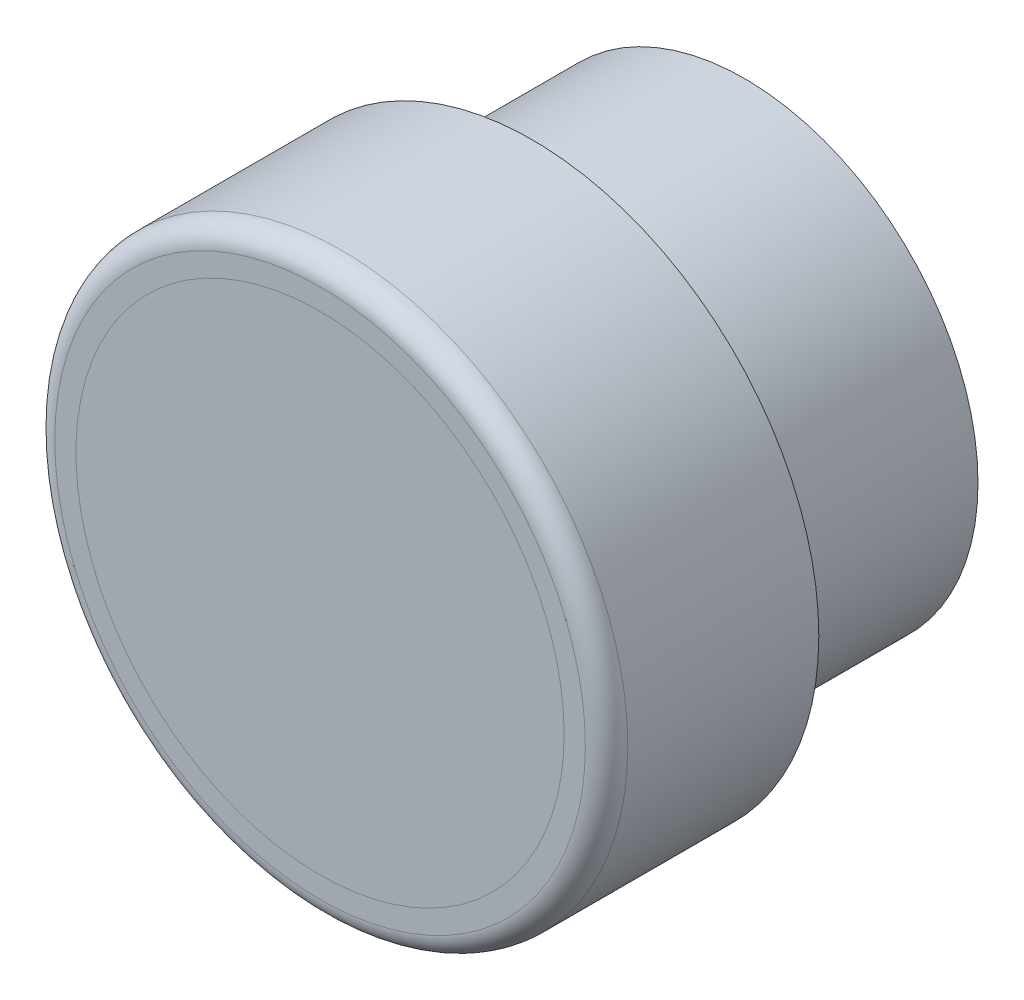
ISO-10303-21;
HEADER;
FILE_DESCRIPTION(('STEP AP214'),'2;1');
FILE_NAME('part.step','',(''),(''),'','','');
FILE_SCHEMA(('AUTOMOTIVE_DESIGN { 1 0 10303 214 1 1 1 1 }'));
ENDSEC;
DATA;
#1=APPLICATION_CONTEXT('core data for automotive mechanical design processes');
#2=APPLICATION_PROTOCOL_DEFINITION('international standard','automotive_design',2000,#1);
#3=PRODUCT_CONTEXT('',#1,'mechanical');
#4=PRODUCT('Part','Part','',(#3));
#5=PRODUCT_RELATED_PRODUCT_CATEGORY('part','',(#4));
#6=PRODUCT_DEFINITION_FORMATION('','',#4);
#7=PRODUCT_DEFINITION_CONTEXT('part definition',#1,'design');
#8=PRODUCT_DEFINITION('design','',#6,#7);
#9=PRODUCT_DEFINITION_SHAPE('','',#8);
#10=(LENGTH_UNIT() NAMED_UNIT(*) SI_UNIT(.MILLI.,.METRE.));
#11=(NAMED_UNIT(*) PLANE_ANGLE_UNIT() SI_UNIT($,.RADIAN.));
#12=(NAMED_UNIT(*) SI_UNIT($,.STERADIAN.) SOLID_ANGLE_UNIT());
#13=UNCERTAINTY_MEASURE_WITH_UNIT(LENGTH_MEASURE(1.E-05),#10,'distance_accuracy_value','');
#14=(GEOMETRIC_REPRESENTATION_CONTEXT(3) GLOBAL_UNCERTAINTY_ASSIGNED_CONTEXT((#13)) GLOBAL_UNIT_ASSIGNED_CONTEXT((#10,
#11,#12)) REPRESENTATION_CONTEXT('',''));
#15=CARTESIAN_POINT('',(0.,0.,0.));
#16=DIRECTION('',(0.,0.,1.));
#17=DIRECTION('',(1.,0.,0.));
#18=AXIS2_PLACEMENT_3D('',#15,#16,#17);
#19=CARTESIAN_POINT('',(0.,0.,20.));
#20=DIRECTION('',(0.,0.,1.));
#21=DIRECTION('',(1.,0.,0.));
#22=AXIS2_PLACEMENT_3D('',#19,#20,#21);
#23=PLANE('',#22);
#24=CARTESIAN_POINT('',(0.,0.,20.));
#25=DIRECTION('',(0.,0.,1.));
#26=DIRECTION('',(1.,0.,0.));
#27=AXIS2_PLACEMENT_3D('',#24,#25,#26);
#28=CIRCLE('',#27,12.5);
#29=CARTESIAN_POINT('',(12.5,0.,20.));
#30=VERTEX_POINT('',#29);
#31=EDGE_CURVE('E42',#30,#30,#28,.T.);
#32=ORIENTED_EDGE('',*,*,#31,.T.);
#33=EDGE_LOOP('',(#32));
#34=FACE_BOUND('',#33,.T.);
#35=CARTESIAN_POINT('',(0.,0.,20.));
#36=DIRECTION('',(0.,0.,1.));
#37=DIRECTION('',(1.,0.,0.));
#38=AXIS2_PLACEMENT_3D('',#35,#36,#37);
#39=CIRCLE('',#38,11.5);
#40=CARTESIAN_POINT('',(11.5,0.,20.));
#41=VERTEX_POINT('',#40);
#42=EDGE_CURVE('E46',#41,#41,#39,.F.);
#43=ORIENTED_EDGE('',*,*,#42,.T.);
#44=EDGE_LOOP('',(#43));
#45=FACE_BOUND('',#44,.T.);
#46=ADVANCED_FACE('F35',(#34,#45),#23,.T.);
#47=CARTESIAN_POINT('',(0.,0.,10.));
#48=DIRECTION('',(0.,0.,-1.));
#49=DIRECTION('',(-1.,0.,0.));
#50=AXIS2_PLACEMENT_3D('',#47,#48,#49);
#51=CYLINDRICAL_SURFACE('',#50,11.);
#52=CARTESIAN_POINT('',(0.,0.,10.));
#53=DIRECTION('',(0.,0.,1.));
#54=DIRECTION('',(1.,0.,0.));
#55=AXIS2_PLACEMENT_3D('',#52,#53,#54);
#56=CIRCLE('',#55,11.);
#57=CARTESIAN_POINT('',(11.,0.,10.));
#58=VERTEX_POINT('',#57);
#59=EDGE_CURVE('E51',#58,#58,#56,.T.);
#60=ORIENTED_EDGE('',*,*,#59,.F.);
#61=EDGE_LOOP('',(#60));
#62=FACE_BOUND('',#61,.T.);
#63=CARTESIAN_POINT('',(0.,0.,0.));
#64=DIRECTION('',(0.,0.,1.));
#65=DIRECTION('',(1.,0.,0.));
#66=AXIS2_PLACEMENT_3D('',#63,#64,#65);
#67=CIRCLE('',#66,11.);
#68=CARTESIAN_POINT('',(11.,0.,0.));
#69=VERTEX_POINT('',#68);
#70=EDGE_CURVE('E54',#69,#69,#67,.T.);
#71=ORIENTED_EDGE('',*,*,#70,.T.);
#72=EDGE_LOOP('',(#71));
#73=FACE_BOUND('',#72,.T.);
#74=ADVANCED_FACE('F79',(#62,#73),#51,.T.);
#75=CARTESIAN_POINT('',(0.,0.,0.));
#76=DIRECTION('',(0.,0.,1.));
#77=DIRECTION('',(1.,0.,0.));
#78=AXIS2_PLACEMENT_3D('',#75,#76,#77);
#79=PLANE('',#78);
#80=ORIENTED_EDGE('',*,*,#70,.F.);
#81=EDGE_LOOP('',(#80));
#82=FACE_BOUND('',#81,.T.);
#83=ADVANCED_FACE('F83',(#82),#79,.F.);
#84=CARTESIAN_POINT('',(0.,0.,20.));
#85=DIRECTION('',(0.,0.,-1.));
#86=DIRECTION('',(-1.,0.,0.));
#87=AXIS2_PLACEMENT_3D('',#84,#85,#86);
#88=CYLINDRICAL_SURFACE('',#87,13.5);
#89=CARTESIAN_POINT('',(0.,0.,19.));
#90=DIRECTION('',(0.,0.,1.));
#91=DIRECTION('',(1.,0.,0.));
#92=AXIS2_PLACEMENT_3D('',#89,#90,#91);
#93=CIRCLE('',#92,13.5);
#94=CARTESIAN_POINT('',(13.5,0.,19.));
#95=VERTEX_POINT('',#94);
#96=EDGE_CURVE('E10',#95,#95,#93,.F.);
#97=ORIENTED_EDGE('',*,*,#96,.T.);
#98=EDGE_LOOP('',(#97));
#99=FACE_BOUND('',#98,.T.);
#100=CARTESIAN_POINT('',(0.,0.,10.));
#101=DIRECTION('',(0.,0.,1.));
#102=DIRECTION('',(1.,0.,0.));
#103=AXIS2_PLACEMENT_3D('',#100,#101,#102);
#104=CIRCLE('',#103,13.5);
#105=CARTESIAN_POINT('',(13.5,0.,10.));
#106=VERTEX_POINT('',#105);
#107=EDGE_CURVE('E57',#106,#106,#104,.T.);
#108=ORIENTED_EDGE('',*,*,#107,.T.);
#109=EDGE_LOOP('',(#108));
#110=FACE_BOUND('',#109,.T.);
#111=ADVANCED_FACE('F63',(#99,#110),#88,.T.);
#112=ORIENTED_EDGE('',*,*,#42,.F.);
#113=EDGE_LOOP('',(#112));
#114=FACE_BOUND('',#113,.T.);
#115=ADVANCED_FACE('F67',(#114),#23,.T.);
#116=CARTESIAN_POINT('',(0.,0.,10.));
#117=DIRECTION('',(0.,0.,1.));
#118=DIRECTION('',(1.,0.,0.));
#119=AXIS2_PLACEMENT_3D('',#116,#117,#118);
#120=PLANE('',#119);
#121=ORIENTED_EDGE('',*,*,#59,.T.);
#122=EDGE_LOOP('',(#121));
#123=FACE_BOUND('',#122,.T.);
#124=ORIENTED_EDGE('',*,*,#107,.F.);
#125=EDGE_LOOP('',(#124));
#126=FACE_BOUND('',#125,.T.);
#127=ADVANCED_FACE('F65',(#123,#126),#120,.F.);
#128=CARTESIAN_POINT('',(0.,0.,19.));
#129=DIRECTION('',(0.,0.,1.));
#130=DIRECTION('',(1.,0.,0.));
#131=AXIS2_PLACEMENT_3D('',#128,#129,#130);
#132=TOROIDAL_SURFACE('',#131,12.5,1.);
#133=ORIENTED_EDGE('',*,*,#96,.F.);
#134=EDGE_LOOP('',(#133));
#135=FACE_BOUND('',#134,.T.);
#136=ORIENTED_EDGE('',*,*,#31,.F.);
#137=EDGE_LOOP('',(#136));
#138=FACE_BOUND('',#137,.T.);
#139=ADVANCED_FACE('F37',(#135,#138),#132,.T.);
#140=CLOSED_SHELL('',(#46,#74,#83,#111,#115,#127,#139));
#141=MANIFOLD_SOLID_BREP('B2',#140);
#142=ADVANCED_BREP_SHAPE_REPRESENTATION('',(#18,#141),#14);
#143=SHAPE_DEFINITION_REPRESENTATION(#9,#142);
ENDSEC;
END-ISO-10303-21;
